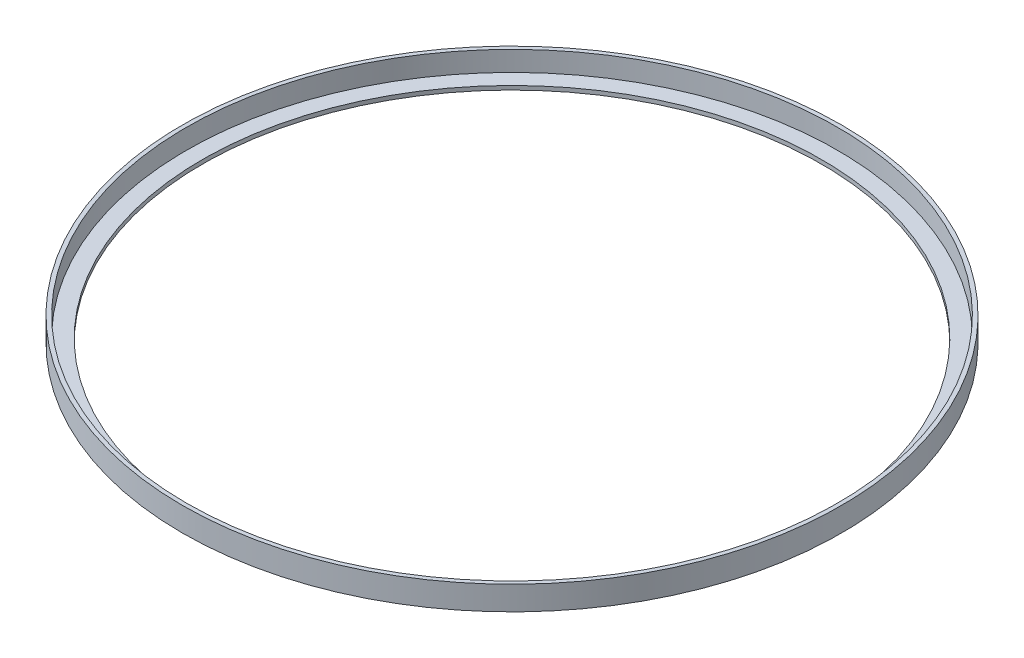
ISO-10303-21;
HEADER;
FILE_DESCRIPTION(('STEP AP214'),'2;1');
FILE_NAME('part.step','',(''),(''),'','','');
FILE_SCHEMA(('AUTOMOTIVE_DESIGN { 1 0 10303 214 1 1 1 1 }'));
ENDSEC;
DATA;
#1=APPLICATION_CONTEXT('core data for automotive mechanical design processes');
#2=APPLICATION_PROTOCOL_DEFINITION('international standard','automotive_design',2000,#1);
#3=PRODUCT_CONTEXT('',#1,'mechanical');
#4=PRODUCT('Part','Part','',(#3));
#5=PRODUCT_RELATED_PRODUCT_CATEGORY('part','',(#4));
#6=PRODUCT_DEFINITION_FORMATION('','',#4);
#7=PRODUCT_DEFINITION_CONTEXT('part definition',#1,'design');
#8=PRODUCT_DEFINITION('design','',#6,#7);
#9=PRODUCT_DEFINITION_SHAPE('','',#8);
#10=(LENGTH_UNIT() NAMED_UNIT(*) SI_UNIT(.MILLI.,.METRE.));
#11=(NAMED_UNIT(*) PLANE_ANGLE_UNIT() SI_UNIT($,.RADIAN.));
#12=(NAMED_UNIT(*) SI_UNIT($,.STERADIAN.) SOLID_ANGLE_UNIT());
#13=UNCERTAINTY_MEASURE_WITH_UNIT(LENGTH_MEASURE(1.E-05),#10,'distance_accuracy_value','');
#14=(GEOMETRIC_REPRESENTATION_CONTEXT(3) GLOBAL_UNCERTAINTY_ASSIGNED_CONTEXT((#13)) GLOBAL_UNIT_ASSIGNED_CONTEXT((#10,
#11,#12)) REPRESENTATION_CONTEXT('',''));
#15=CARTESIAN_POINT('',(0.,0.,0.));
#16=DIRECTION('',(0.,0.,1.));
#17=DIRECTION('',(1.,0.,0.));
#18=AXIS2_PLACEMENT_3D('',#15,#16,#17);
#19=CARTESIAN_POINT('',(0.,0.4,0.));
#20=DIRECTION('',(0.,1.,0.));
#21=DIRECTION('',(0.,0.,1.));
#22=AXIS2_PLACEMENT_3D('',#19,#20,#21);
#23=PLANE('',#22);
#24=CARTESIAN_POINT('',(0.,0.4,0.));
#25=DIRECTION('',(0.,1.,0.));
#26=DIRECTION('',(0.,0.,1.));
#27=AXIS2_PLACEMENT_3D('',#24,#25,#26);
#28=CIRCLE('',#27,31.);
#29=CARTESIAN_POINT('',(0.,0.4,31.));
#30=VERTEX_POINT('',#29);
#31=EDGE_CURVE('E46',#30,#30,#28,.T.);
#32=ORIENTED_EDGE('',*,*,#31,.F.);
#33=EDGE_LOOP('',(#32));
#34=FACE_BOUND('',#33,.T.);
#35=CARTESIAN_POINT('',(0.,0.4,0.));
#36=DIRECTION('',(0.,1.,0.));
#37=DIRECTION('',(0.,0.,1.));
#38=AXIS2_PLACEMENT_3D('',#35,#36,#37);
#39=CIRCLE('',#38,32.6);
#40=CARTESIAN_POINT('',(0.,0.4,32.6));
#41=VERTEX_POINT('',#40);
#42=EDGE_CURVE('E10',#41,#41,#39,.F.);
#43=ORIENTED_EDGE('',*,*,#42,.F.);
#44=EDGE_LOOP('',(#43));
#45=FACE_BOUND('',#44,.T.);
#46=ADVANCED_FACE('F35',(#34,#45),#23,.T.);
#47=CARTESIAN_POINT('',(0.,0.,0.));
#48=DIRECTION('',(0.,1.,0.));
#49=DIRECTION('',(0.,0.,1.));
#50=AXIS2_PLACEMENT_3D('',#47,#48,#49);
#51=PLANE('',#50);
#52=CARTESIAN_POINT('',(0.,0.,0.));
#53=DIRECTION('',(0.,1.,0.));
#54=DIRECTION('',(0.,0.,1.));
#55=AXIS2_PLACEMENT_3D('',#52,#53,#54);
#56=CIRCLE('',#55,33.);
#57=CARTESIAN_POINT('',(0.,0.,33.));
#58=VERTEX_POINT('',#57);
#59=EDGE_CURVE('E42',#58,#58,#56,.T.);
#60=ORIENTED_EDGE('',*,*,#59,.F.);
#61=EDGE_LOOP('',(#60));
#62=FACE_BOUND('',#61,.T.);
#63=CARTESIAN_POINT('',(0.,0.,0.));
#64=DIRECTION('',(0.,1.,0.));
#65=DIRECTION('',(0.,0.,1.));
#66=AXIS2_PLACEMENT_3D('',#63,#64,#65);
#67=CIRCLE('',#66,31.);
#68=CARTESIAN_POINT('',(0.,0.,31.));
#69=VERTEX_POINT('',#68);
#70=EDGE_CURVE('E50',#69,#69,#67,.T.);
#71=ORIENTED_EDGE('',*,*,#70,.T.);
#72=EDGE_LOOP('',(#71));
#73=FACE_BOUND('',#72,.T.);
#74=ADVANCED_FACE('F77',(#62,#73),#51,.F.);
#75=CARTESIAN_POINT('',(0.,0.4,0.));
#76=DIRECTION('',(0.,-1.,0.));
#77=DIRECTION('',(0.,0.,-1.));
#78=AXIS2_PLACEMENT_3D('',#75,#76,#77);
#79=CYLINDRICAL_SURFACE('',#78,33.);
#80=ORIENTED_EDGE('',*,*,#59,.T.);
#81=EDGE_LOOP('',(#80));
#82=FACE_BOUND('',#81,.T.);
#83=CARTESIAN_POINT('',(0.,2.4,0.));
#84=DIRECTION('',(0.,1.,0.));
#85=DIRECTION('',(0.,0.,1.));
#86=AXIS2_PLACEMENT_3D('',#83,#84,#85);
#87=CIRCLE('',#86,33.);
#88=CARTESIAN_POINT('',(0.,2.4,33.));
#89=VERTEX_POINT('',#88);
#90=EDGE_CURVE('E54',#89,#89,#87,.T.);
#91=ORIENTED_EDGE('',*,*,#90,.F.);
#92=EDGE_LOOP('',(#91));
#93=FACE_BOUND('',#92,.T.);
#94=ADVANCED_FACE('F37',(#82,#93),#79,.T.);
#95=CARTESIAN_POINT('',(0.,0.4,0.));
#96=DIRECTION('',(0.,-1.,0.));
#97=DIRECTION('',(0.,0.,-1.));
#98=AXIS2_PLACEMENT_3D('',#95,#96,#97);
#99=CYLINDRICAL_SURFACE('',#98,31.);
#100=ORIENTED_EDGE('',*,*,#31,.T.);
#101=EDGE_LOOP('',(#100));
#102=FACE_BOUND('',#101,.T.);
#103=ORIENTED_EDGE('',*,*,#70,.F.);
#104=EDGE_LOOP('',(#103));
#105=FACE_BOUND('',#104,.T.);
#106=ADVANCED_FACE('F66',(#102,#105),#99,.F.);
#107=CARTESIAN_POINT('',(0.,2.4,0.));
#108=DIRECTION('',(0.,1.,0.));
#109=DIRECTION('',(0.,0.,1.));
#110=AXIS2_PLACEMENT_3D('',#107,#108,#109);
#111=PLANE('',#110);
#112=ORIENTED_EDGE('',*,*,#90,.T.);
#113=EDGE_LOOP('',(#112));
#114=FACE_BOUND('',#113,.T.);
#115=CARTESIAN_POINT('',(0.,2.4,0.));
#116=DIRECTION('',(0.,1.,0.));
#117=DIRECTION('',(0.,0.,1.));
#118=AXIS2_PLACEMENT_3D('',#115,#116,#117);
#119=CIRCLE('',#118,32.6);
#120=CARTESIAN_POINT('',(0.,2.4,32.6));
#121=VERTEX_POINT('',#120);
#122=EDGE_CURVE('E58',#121,#121,#119,.T.);
#123=ORIENTED_EDGE('',*,*,#122,.F.);
#124=EDGE_LOOP('',(#123));
#125=FACE_BOUND('',#124,.T.);
#126=ADVANCED_FACE('F64',(#114,#125),#111,.T.);
#127=CARTESIAN_POINT('',(0.,2.4,0.));
#128=DIRECTION('',(0.,-1.,0.));
#129=DIRECTION('',(0.,0.,-1.));
#130=AXIS2_PLACEMENT_3D('',#127,#128,#129);
#131=CYLINDRICAL_SURFACE('',#130,32.6);
#132=ORIENTED_EDGE('',*,*,#122,.T.);
#133=EDGE_LOOP('',(#132));
#134=FACE_BOUND('',#133,.T.);
#135=ORIENTED_EDGE('',*,*,#42,.T.);
#136=EDGE_LOOP('',(#135));
#137=FACE_BOUND('',#136,.T.);
#138=ADVANCED_FACE('F62',(#134,#137),#131,.F.);
#139=CLOSED_SHELL('',(#46,#74,#94,#106,#126,#138));
#140=MANIFOLD_SOLID_BREP('B2',#139);
#141=ADVANCED_BREP_SHAPE_REPRESENTATION('',(#18,#140),#14);
#142=SHAPE_DEFINITION_REPRESENTATION(#9,#141);
ENDSEC;
END-ISO-10303-21;
